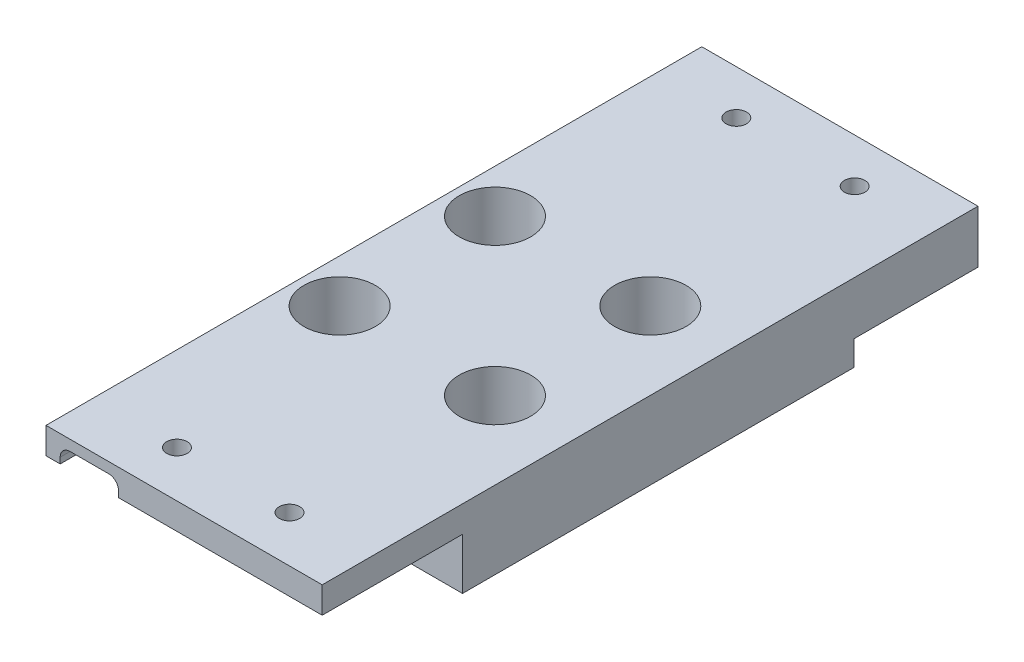
ISO-10303-21;
HEADER;
FILE_DESCRIPTION(('STEP AP214'),'2;1');
FILE_NAME('part.step','',(''),(''),'','','');
FILE_SCHEMA(('AUTOMOTIVE_DESIGN { 1 0 10303 214 1 1 1 1 }'));
ENDSEC;
DATA;
#1=APPLICATION_CONTEXT('core data for automotive mechanical design processes');
#2=APPLICATION_PROTOCOL_DEFINITION('international standard','automotive_design',2000,#1);
#3=PRODUCT_CONTEXT('',#1,'mechanical');
#4=PRODUCT('Part','Part','',(#3));
#5=PRODUCT_RELATED_PRODUCT_CATEGORY('part','',(#4));
#6=PRODUCT_DEFINITION_FORMATION('','',#4);
#7=PRODUCT_DEFINITION_CONTEXT('part definition',#1,'design');
#8=PRODUCT_DEFINITION('design','',#6,#7);
#9=PRODUCT_DEFINITION_SHAPE('','',#8);
#10=(LENGTH_UNIT() NAMED_UNIT(*) SI_UNIT(.MILLI.,.METRE.));
#11=(NAMED_UNIT(*) PLANE_ANGLE_UNIT() SI_UNIT($,.RADIAN.));
#12=(NAMED_UNIT(*) SI_UNIT($,.STERADIAN.) SOLID_ANGLE_UNIT());
#13=UNCERTAINTY_MEASURE_WITH_UNIT(LENGTH_MEASURE(1.E-05),#10,'distance_accuracy_value','');
#14=(GEOMETRIC_REPRESENTATION_CONTEXT(3) GLOBAL_UNCERTAINTY_ASSIGNED_CONTEXT((#13)) GLOBAL_UNIT_ASSIGNED_CONTEXT((#10,
#11,#12)) REPRESENTATION_CONTEXT('',''));
#15=CARTESIAN_POINT('',(0.,0.,0.));
#16=DIRECTION('',(0.,0.,1.));
#17=DIRECTION('',(1.,0.,0.));
#18=AXIS2_PLACEMENT_3D('',#15,#16,#17);
#19=CARTESIAN_POINT('',(22.225,8.255,56.5724449356271));
#20=DIRECTION('',(0.,1.,0.));
#21=DIRECTION('',(0.,0.,1.));
#22=AXIS2_PLACEMENT_3D('',#19,#20,#21);
#23=PLANE('',#22);
#24=CARTESIAN_POINT('',(9.52499998215118,8.255,71.7115405999993));
#25=DIRECTION('',(0.,1.,0.));
#26=DIRECTION('',(0.,0.,1.));
#27=AXIS2_PLACEMENT_3D('',#24,#25,#26);
#28=CIRCLE('',#27,1.64999999999999);
#29=CARTESIAN_POINT('',(9.52499998215118,8.255,73.3615405999993));
#30=VERTEX_POINT('',#29);
#31=EDGE_CURVE('E49',#30,#30,#28,.T.);
#32=ORIENTED_EDGE('',*,*,#31,.T.);
#33=EDGE_LOOP('',(#32));
#34=FACE_BOUND('',#33,.T.);
#35=CARTESIAN_POINT('',(-8.59689660784882,8.255,71.7115405999993));
#36=DIRECTION('',(0.,1.,0.));
#37=DIRECTION('',(0.,0.,1.));
#38=AXIS2_PLACEMENT_3D('',#35,#36,#37);
#39=CIRCLE('',#38,1.64999999999999);
#40=CARTESIAN_POINT('',(-8.59689660784882,8.255,73.3615405999993));
#41=VERTEX_POINT('',#40);
#42=EDGE_CURVE('E314',#41,#41,#39,.T.);
#43=ORIENTED_EDGE('',*,*,#42,.T.);
#44=EDGE_LOOP('',(#43));
#45=FACE_BOUND('',#44,.T.);
#46=DIRECTION('',(-1.,0.,0.));
#47=VECTOR('',#46,1.);
#48=CARTESIAN_POINT('',(22.225,8.255,79.1557218));
#49=LINE('',#48,#47);
#50=CARTESIAN_POINT('',(22.225,8.255,79.1557218));
#51=VERTEX_POINT('',#50);
#52=CARTESIAN_POINT('',(-10.5442004,8.255,79.1557218));
#53=VERTEX_POINT('',#52);
#54=EDGE_CURVE('E165',#51,#53,#49,.T.);
#55=ORIENTED_EDGE('',*,*,#54,.T.);
#56=DIRECTION('',(0.,0.,1.));
#57=VECTOR('',#56,1.);
#58=CARTESIAN_POINT('',(-10.5442004,8.255,79.1557218));
#59=LINE('',#58,#57);
#60=CARTESIAN_POINT('',(-10.5442004,8.255,58.1599449356271));
#61=VERTEX_POINT('',#60);
#62=EDGE_CURVE('E174',#61,#53,#59,.T.);
#63=ORIENTED_EDGE('',*,*,#62,.F.);
#64=CARTESIAN_POINT('',(-12.1317004,8.255,58.1599449356271));
#65=DIRECTION('',(0.,1.,0.));
#66=DIRECTION('',(0.,0.,1.));
#67=AXIS2_PLACEMENT_3D('',#64,#65,#66);
#68=CIRCLE('',#67,1.5875);
#69=CARTESIAN_POINT('',(-12.1317004,8.255,56.5724449356271));
#70=VERTEX_POINT('',#69);
#71=EDGE_CURVE('E13',#61,#70,#68,.T.);
#72=ORIENTED_EDGE('',*,*,#71,.T.);
#73=DIRECTION('',(1.,0.,0.));
#74=VECTOR('',#73,1.);
#75=CARTESIAN_POINT('',(22.225,8.255,56.5724449356271));
#76=LINE('',#75,#74);
#77=CARTESIAN_POINT('',(22.225,8.255,56.5724449356271));
#78=VERTEX_POINT('',#77);
#79=EDGE_CURVE('E188',#70,#78,#76,.T.);
#80=ORIENTED_EDGE('',*,*,#79,.T.);
#81=DIRECTION('',(0.,0.,1.));
#82=VECTOR('',#81,1.);
#83=CARTESIAN_POINT('',(22.225,8.255,79.1557218));
#84=LINE('',#83,#82);
#85=EDGE_CURVE('E184',#78,#51,#84,.T.);
#86=ORIENTED_EDGE('',*,*,#85,.T.);
#87=EDGE_LOOP('',(#55,#63,#72,#80,#86));
#88=FACE_BOUND('',#87,.T.);
#89=ADVANCED_FACE('F45',(#34,#45,#88),#23,.F.);
#90=CARTESIAN_POINT('',(-22.225,12.5,-26.3852406));
#91=DIRECTION('',(0.,0.,1.));
#92=DIRECTION('',(1.,0.,0.));
#93=AXIS2_PLACEMENT_3D('',#90,#91,#92);
#94=PLANE('',#93);
#95=DIRECTION('',(1.,0.,0.));
#96=VECTOR('',#95,1.);
#97=CARTESIAN_POINT('',(22.225,4.,-26.3852406));
#98=LINE('',#97,#96);
#99=CARTESIAN_POINT('',(-22.225,4.,-26.3852406));
#100=VERTEX_POINT('',#99);
#101=CARTESIAN_POINT('',(22.225,4.,-26.3852406));
#102=VERTEX_POINT('',#101);
#103=EDGE_CURVE('E363',#100,#102,#98,.T.);
#104=ORIENTED_EDGE('',*,*,#103,.F.);
#105=DIRECTION('',(0.,-1.,0.));
#106=VECTOR('',#105,1.);
#107=CARTESIAN_POINT('',(-22.225,12.5,-26.3852406));
#108=LINE('',#107,#106);
#109=CARTESIAN_POINT('',(-22.225,12.5,-26.3852406));
#110=VERTEX_POINT('',#109);
#111=EDGE_CURVE('E274',#110,#100,#108,.T.);
#112=ORIENTED_EDGE('',*,*,#111,.F.);
#113=DIRECTION('',(-1.,0.,0.));
#114=VECTOR('',#113,1.);
#115=CARTESIAN_POINT('',(-22.225,12.5,-26.3852406));
#116=LINE('',#115,#114);
#117=CARTESIAN_POINT('',(22.225,12.5,-26.3852406));
#118=VERTEX_POINT('',#117);
#119=EDGE_CURVE('E272',#118,#110,#116,.T.);
#120=ORIENTED_EDGE('',*,*,#119,.F.);
#121=DIRECTION('',(0.,-1.,0.));
#122=VECTOR('',#121,1.);
#123=CARTESIAN_POINT('',(22.225,12.5,-26.3852406));
#124=LINE('',#123,#122);
#125=EDGE_CURVE('E280',#118,#102,#124,.T.);
#126=ORIENTED_EDGE('',*,*,#125,.T.);
#127=EDGE_LOOP('',(#104,#112,#120,#126));
#128=FACE_BOUND('',#127,.T.);
#129=ADVANCED_FACE('F376',(#128),#94,.F.);
#130=CARTESIAN_POINT('',(9.52500001784898,12.5,-19.2362653246633));
#131=DIRECTION('',(0.,1.,0.));
#132=DIRECTION('',(0.,0.,1.));
#133=AXIS2_PLACEMENT_3D('',#130,#131,#132);
#134=CYLINDRICAL_SURFACE('',#133,1.64999999999999);
#135=CARTESIAN_POINT('',(9.52500001784898,12.5,-19.2362653246633));
#136=DIRECTION('',(0.,1.,0.));
#137=DIRECTION('',(0.,0.,1.));
#138=AXIS2_PLACEMENT_3D('',#135,#136,#137);
#139=CIRCLE('',#138,1.64999999999999);
#140=CARTESIAN_POINT('',(9.52500001784898,12.5,-17.5862653246634));
#141=VERTEX_POINT('',#140);
#142=EDGE_CURVE('E263',#141,#141,#139,.T.);
#143=ORIENTED_EDGE('',*,*,#142,.T.);
#144=EDGE_LOOP('',(#143));
#145=FACE_BOUND('',#144,.T.);
#146=CARTESIAN_POINT('',(9.52500001784898,4.,-19.2362653246633));
#147=DIRECTION('',(0.,-1.,0.));
#148=DIRECTION('',(0.,0.,-1.));
#149=AXIS2_PLACEMENT_3D('',#146,#147,#148);
#150=CIRCLE('',#149,1.64999999999999);
#151=CARTESIAN_POINT('',(9.52500001784898,4.,-20.8862653246633));
#152=VERTEX_POINT('',#151);
#153=EDGE_CURVE('E198',#152,#152,#150,.F.);
#154=ORIENTED_EDGE('',*,*,#153,.F.);
#155=EDGE_LOOP('',(#154));
#156=FACE_BOUND('',#155,.T.);
#157=ADVANCED_FACE('F373',(#145,#156),#134,.F.);
#158=CARTESIAN_POINT('',(-9.52500001784898,12.5,-19.2362653246633));
#159=DIRECTION('',(0.,1.,0.));
#160=DIRECTION('',(0.,0.,1.));
#161=AXIS2_PLACEMENT_3D('',#158,#159,#160);
#162=CYLINDRICAL_SURFACE('',#161,1.64999999999999);
#163=CARTESIAN_POINT('',(-9.52500001784898,12.5,-19.2362653246633));
#164=DIRECTION('',(0.,1.,0.));
#165=DIRECTION('',(0.,0.,1.));
#166=AXIS2_PLACEMENT_3D('',#163,#164,#165);
#167=CIRCLE('',#166,1.64999999999999);
#168=CARTESIAN_POINT('',(-9.52500001784898,12.5,-17.5862653246634));
#169=VERTEX_POINT('',#168);
#170=EDGE_CURVE('E260',#169,#169,#167,.T.);
#171=ORIENTED_EDGE('',*,*,#170,.T.);
#172=EDGE_LOOP('',(#171));
#173=FACE_BOUND('',#172,.T.);
#174=CARTESIAN_POINT('',(-9.52500001784898,4.,-19.2362653246633));
#175=DIRECTION('',(0.,-1.,0.));
#176=DIRECTION('',(0.,0.,-1.));
#177=AXIS2_PLACEMENT_3D('',#174,#175,#176);
#178=CIRCLE('',#177,1.64999999999999);
#179=CARTESIAN_POINT('',(-9.52500001784898,4.,-20.8862653246633));
#180=VERTEX_POINT('',#179);
#181=EDGE_CURVE('E284',#180,#180,#178,.F.);
#182=ORIENTED_EDGE('',*,*,#181,.F.);
#183=EDGE_LOOP('',(#182));
#184=FACE_BOUND('',#183,.T.);
#185=ADVANCED_FACE('F375',(#173,#184),#162,.F.);
#186=CARTESIAN_POINT('',(-22.225,12.5,-26.3852406));
#187=DIRECTION('',(1.,0.,0.));
#188=DIRECTION('',(0.,0.,-1.));
#189=AXIS2_PLACEMENT_3D('',#186,#187,#188);
#190=PLANE('',#189);
#191=DIRECTION('',(0.,0.,-1.));
#192=VECTOR('',#191,1.);
#193=CARTESIAN_POINT('',(-22.225,4.,-26.3852406));
#194=LINE('',#193,#192);
#195=CARTESIAN_POINT('',(-22.225,4.,-6.4099656));
#196=VERTEX_POINT('',#195);
#197=EDGE_CURVE('E361',#196,#100,#194,.T.);
#198=ORIENTED_EDGE('',*,*,#197,.F.);
#199=DIRECTION('',(0.,-1.,0.));
#200=VECTOR('',#199,1.);
#201=CARTESIAN_POINT('',(-22.225,4.,-6.4099656));
#202=LINE('',#201,#200);
#203=CARTESIAN_POINT('',(-22.225,0.,-6.4099656));
#204=VERTEX_POINT('',#203);
#205=EDGE_CURVE('E287',#196,#204,#202,.T.);
#206=ORIENTED_EDGE('',*,*,#205,.T.);
#207=DIRECTION('',(0.,0.,1.));
#208=VECTOR('',#207,1.);
#209=CARTESIAN_POINT('',(-22.225,0.,-26.3852406));
#210=LINE('',#209,#208);
#211=CARTESIAN_POINT('',(-22.225,0.,56.5724449356271));
#212=VERTEX_POINT('',#211);
#213=EDGE_CURVE('E266',#204,#212,#210,.T.);
#214=ORIENTED_EDGE('',*,*,#213,.T.);
#215=DIRECTION('',(0.,-1.,0.));
#216=VECTOR('',#215,1.);
#217=CARTESIAN_POINT('',(-22.225,8.255,56.5724449356271));
#218=LINE('',#217,#216);
#219=CARTESIAN_POINT('',(-22.225,8.255,56.5724449356271));
#220=VERTEX_POINT('',#219);
#221=EDGE_CURVE('E195',#220,#212,#218,.T.);
#222=ORIENTED_EDGE('',*,*,#221,.F.);
#223=DIRECTION('',(0.,0.,-1.));
#224=VECTOR('',#223,1.);
#225=CARTESIAN_POINT('',(-22.225,8.255,79.1557218));
#226=LINE('',#225,#224);
#227=CARTESIAN_POINT('',(-22.225,8.255,79.1557218));
#228=VERTEX_POINT('',#227);
#229=EDGE_CURVE('E185',#228,#220,#226,.T.);
#230=ORIENTED_EDGE('',*,*,#229,.F.);
#231=DIRECTION('',(0.,-1.,0.));
#232=VECTOR('',#231,1.);
#233=CARTESIAN_POINT('',(-22.225,12.5,79.1557218));
#234=LINE('',#233,#232);
#235=CARTESIAN_POINT('',(-22.225,12.5,79.1557218));
#236=VERTEX_POINT('',#235);
#237=EDGE_CURVE('E233',#236,#228,#234,.T.);
#238=ORIENTED_EDGE('',*,*,#237,.F.);
#239=DIRECTION('',(0.,0.,1.));
#240=VECTOR('',#239,1.);
#241=CARTESIAN_POINT('',(-22.225,12.5,-26.3852406));
#242=LINE('',#241,#240);
#243=EDGE_CURVE('E267',#110,#236,#242,.T.);
#244=ORIENTED_EDGE('',*,*,#243,.F.);
#245=ORIENTED_EDGE('',*,*,#111,.T.);
#246=EDGE_LOOP('',(#198,#206,#214,#222,#230,#238,#244,#245));
#247=FACE_BOUND('',#246,.T.);
#248=ADVANCED_FACE('F383',(#247),#190,.F.);
#249=CARTESIAN_POINT('',(22.225,12.5,-26.3852406));
#250=DIRECTION('',(-1.,0.,0.));
#251=DIRECTION('',(0.,0.,1.));
#252=AXIS2_PLACEMENT_3D('',#249,#250,#251);
#253=PLANE('',#252);
#254=DIRECTION('',(0.,0.,-1.));
#255=VECTOR('',#254,1.);
#256=CARTESIAN_POINT('',(22.225,0.,-26.3852406));
#257=LINE('',#256,#255);
#258=CARTESIAN_POINT('',(22.225,0.,56.5724449356271));
#259=VERTEX_POINT('',#258);
#260=CARTESIAN_POINT('',(22.225,0.,-6.4099656));
#261=VERTEX_POINT('',#260);
#262=EDGE_CURVE('E270',#259,#261,#257,.T.);
#263=ORIENTED_EDGE('',*,*,#262,.T.);
#264=DIRECTION('',(0.,-1.,0.));
#265=VECTOR('',#264,1.);
#266=CARTESIAN_POINT('',(22.225,4.,-6.4099656));
#267=LINE('',#266,#265);
#268=CARTESIAN_POINT('',(22.225,4.,-6.4099656));
#269=VERTEX_POINT('',#268);
#270=EDGE_CURVE('E364',#269,#261,#267,.T.);
#271=ORIENTED_EDGE('',*,*,#270,.F.);
#272=DIRECTION('',(0.,0.,1.));
#273=VECTOR('',#272,1.);
#274=CARTESIAN_POINT('',(22.225,4.,-26.3852406));
#275=LINE('',#274,#273);
#276=EDGE_CURVE('E352',#102,#269,#275,.T.);
#277=ORIENTED_EDGE('',*,*,#276,.F.);
#278=ORIENTED_EDGE('',*,*,#125,.F.);
#279=DIRECTION('',(0.,0.,-1.));
#280=VECTOR('',#279,1.);
#281=CARTESIAN_POINT('',(22.225,12.5,-26.3852406));
#282=LINE('',#281,#280);
#283=CARTESIAN_POINT('',(22.225,12.5,79.1557218));
#284=VERTEX_POINT('',#283);
#285=EDGE_CURVE('E269',#284,#118,#282,.T.);
#286=ORIENTED_EDGE('',*,*,#285,.F.);
#287=DIRECTION('',(0.,-1.,0.));
#288=VECTOR('',#287,1.);
#289=CARTESIAN_POINT('',(22.225,12.5,79.1557218));
#290=LINE('',#289,#288);
#291=EDGE_CURVE('E231',#284,#51,#290,.T.);
#292=ORIENTED_EDGE('',*,*,#291,.T.);
#293=ORIENTED_EDGE('',*,*,#85,.F.);
#294=DIRECTION('',(0.,-1.,0.));
#295=VECTOR('',#294,1.);
#296=CARTESIAN_POINT('',(22.225,8.255,56.5724449356271));
#297=LINE('',#296,#295);
#298=EDGE_CURVE('E199',#78,#259,#297,.T.);
#299=ORIENTED_EDGE('',*,*,#298,.T.);
#300=EDGE_LOOP('',(#263,#271,#277,#278,#286,#292,#293,#299));
#301=FACE_BOUND('',#300,.T.);
#302=ADVANCED_FACE('F446',(#301),#253,.F.);
#303=CARTESIAN_POINT('',(-22.225,12.5,26.3852406));
#304=DIRECTION('',(0.,1.,0.));
#305=DIRECTION('',(0.,0.,1.));
#306=AXIS2_PLACEMENT_3D('',#303,#304,#305);
#307=PLANE('',#306);
#308=CARTESIAN_POINT('',(9.52499998215118,12.5,71.7115405999993));
#309=DIRECTION('',(0.,1.,0.));
#310=DIRECTION('',(0.,0.,1.));
#311=AXIS2_PLACEMENT_3D('',#308,#309,#310);
#312=CIRCLE('',#311,1.64999999999999);
#313=CARTESIAN_POINT('',(9.52499998215118,12.5,73.3615405999993));
#314=VERTEX_POINT('',#313);
#315=EDGE_CURVE('E807',#314,#314,#312,.T.);
#316=ORIENTED_EDGE('',*,*,#315,.F.);
#317=EDGE_LOOP('',(#316));
#318=FACE_BOUND('',#317,.T.);
#319=CARTESIAN_POINT('',(-8.59689660784882,12.5,71.7115405999993));
#320=DIRECTION('',(0.,1.,0.));
#321=DIRECTION('',(0.,0.,1.));
#322=AXIS2_PLACEMENT_3D('',#319,#320,#321);
#323=CIRCLE('',#322,1.64999999999999);
#324=CARTESIAN_POINT('',(-8.59689660784882,12.5,73.3615405999993));
#325=VERTEX_POINT('',#324);
#326=EDGE_CURVE('E809',#325,#325,#323,.T.);
#327=ORIENTED_EDGE('',*,*,#326,.F.);
#328=EDGE_LOOP('',(#327));
#329=FACE_BOUND('',#328,.T.);
#330=CARTESIAN_POINT('',(-15.24,12.5,38.8852406));
#331=DIRECTION('',(0.,1.,0.));
#332=DIRECTION('',(0.,0.,1.));
#333=AXIS2_PLACEMENT_3D('',#330,#331,#332);
#334=CIRCLE('',#333,5.75);
#335=CARTESIAN_POINT('',(-15.24,12.5,44.6352406));
#336=VERTEX_POINT('',#335);
#337=EDGE_CURVE('E202',#336,#336,#334,.T.);
#338=ORIENTED_EDGE('',*,*,#337,.F.);
#339=EDGE_LOOP('',(#338));
#340=FACE_BOUND('',#339,.T.);
#341=CARTESIAN_POINT('',(9.76,12.5,38.8852406));
#342=DIRECTION('',(0.,1.,0.));
#343=DIRECTION('',(0.,0.,1.));
#344=AXIS2_PLACEMENT_3D('',#341,#342,#343);
#345=CIRCLE('',#344,5.75);
#346=CARTESIAN_POINT('',(9.76,12.5,44.6352406));
#347=VERTEX_POINT('',#346);
#348=EDGE_CURVE('E216',#347,#347,#345,.T.);
#349=ORIENTED_EDGE('',*,*,#348,.F.);
#350=EDGE_LOOP('',(#349));
#351=FACE_BOUND('',#350,.T.);
#352=CARTESIAN_POINT('',(-15.24,12.5,13.8852406));
#353=DIRECTION('',(0.,1.,0.));
#354=DIRECTION('',(0.,0.,1.));
#355=AXIS2_PLACEMENT_3D('',#352,#353,#354);
#356=CIRCLE('',#355,5.75);
#357=CARTESIAN_POINT('',(-15.24,12.5,19.6352406));
#358=VERTEX_POINT('',#357);
#359=EDGE_CURVE('E236',#358,#358,#356,.T.);
#360=ORIENTED_EDGE('',*,*,#359,.F.);
#361=EDGE_LOOP('',(#360));
#362=FACE_BOUND('',#361,.T.);
#363=CARTESIAN_POINT('',(9.76,12.5,13.8852406));
#364=DIRECTION('',(0.,1.,0.));
#365=DIRECTION('',(0.,0.,1.));
#366=AXIS2_PLACEMENT_3D('',#363,#364,#365);
#367=CIRCLE('',#366,5.75);
#368=CARTESIAN_POINT('',(9.76,12.5,19.6352406));
#369=VERTEX_POINT('',#368);
#370=EDGE_CURVE('E248',#369,#369,#367,.T.);
#371=ORIENTED_EDGE('',*,*,#370,.F.);
#372=EDGE_LOOP('',(#371));
#373=FACE_BOUND('',#372,.T.);
#374=ORIENTED_EDGE('',*,*,#170,.F.);
#375=EDGE_LOOP('',(#374));
#376=FACE_BOUND('',#375,.T.);
#377=ORIENTED_EDGE('',*,*,#142,.F.);
#378=EDGE_LOOP('',(#377));
#379=FACE_BOUND('',#378,.T.);
#380=ORIENTED_EDGE('',*,*,#243,.T.);
#381=DIRECTION('',(-1.,0.,0.));
#382=VECTOR('',#381,1.);
#383=CARTESIAN_POINT('',(-22.225,12.5,79.1557218));
#384=LINE('',#383,#382);
#385=EDGE_CURVE('E228',#284,#236,#384,.T.);
#386=ORIENTED_EDGE('',*,*,#385,.F.);
#387=ORIENTED_EDGE('',*,*,#285,.T.);
#388=ORIENTED_EDGE('',*,*,#119,.T.);
#389=EDGE_LOOP('',(#380,#386,#387,#388));
#390=FACE_BOUND('',#389,.T.);
#391=ADVANCED_FACE('F450',(#318,#329,#340,#351,#362,#373,#376,#379,#390),#307,.T.);
#392=CARTESIAN_POINT('',(-22.225,0.,26.3852406));
#393=DIRECTION('',(0.,1.,0.));
#394=DIRECTION('',(0.,0.,1.));
#395=AXIS2_PLACEMENT_3D('',#392,#393,#394);
#396=PLANE('',#395);
#397=CARTESIAN_POINT('',(-15.24,0.,38.8852406));
#398=DIRECTION('',(0.,1.,0.));
#399=DIRECTION('',(0.,0.,1.));
#400=AXIS2_PLACEMENT_3D('',#397,#398,#399);
#401=CIRCLE('',#400,3.3);
#402=CARTESIAN_POINT('',(-15.24,0.,42.1852406));
#403=VERTEX_POINT('',#402);
#404=EDGE_CURVE('E213',#403,#403,#401,.T.);
#405=ORIENTED_EDGE('',*,*,#404,.T.);
#406=EDGE_LOOP('',(#405));
#407=FACE_BOUND('',#406,.T.);
#408=CARTESIAN_POINT('',(9.76,0.,38.8852406));
#409=DIRECTION('',(0.,1.,0.));
#410=DIRECTION('',(0.,0.,1.));
#411=AXIS2_PLACEMENT_3D('',#408,#409,#410);
#412=CIRCLE('',#411,3.3);
#413=CARTESIAN_POINT('',(9.76,0.,42.1852406));
#414=VERTEX_POINT('',#413);
#415=EDGE_CURVE('E225',#414,#414,#412,.T.);
#416=ORIENTED_EDGE('',*,*,#415,.T.);
#417=EDGE_LOOP('',(#416));
#418=FACE_BOUND('',#417,.T.);
#419=CARTESIAN_POINT('',(-15.24,0.,13.8852406));
#420=DIRECTION('',(0.,1.,0.));
#421=DIRECTION('',(0.,0.,1.));
#422=AXIS2_PLACEMENT_3D('',#419,#420,#421);
#423=CIRCLE('',#422,3.3);
#424=CARTESIAN_POINT('',(-15.24,0.,17.1852406));
#425=VERTEX_POINT('',#424);
#426=EDGE_CURVE('E245',#425,#425,#423,.T.);
#427=ORIENTED_EDGE('',*,*,#426,.T.);
#428=EDGE_LOOP('',(#427));
#429=FACE_BOUND('',#428,.T.);
#430=CARTESIAN_POINT('',(9.76,0.,13.8852406));
#431=DIRECTION('',(0.,1.,0.));
#432=DIRECTION('',(0.,0.,1.));
#433=AXIS2_PLACEMENT_3D('',#430,#431,#432);
#434=CIRCLE('',#433,3.3);
#435=CARTESIAN_POINT('',(9.76,0.,17.1852406));
#436=VERTEX_POINT('',#435);
#437=EDGE_CURVE('E257',#436,#436,#434,.T.);
#438=ORIENTED_EDGE('',*,*,#437,.T.);
#439=EDGE_LOOP('',(#438));
#440=FACE_BOUND('',#439,.T.);
#441=ORIENTED_EDGE('',*,*,#213,.F.);
#442=DIRECTION('',(-1.,0.,0.));
#443=VECTOR('',#442,1.);
#444=CARTESIAN_POINT('',(22.225,0.,-6.4099656));
#445=LINE('',#444,#443);
#446=EDGE_CURVE('E350',#261,#204,#445,.T.);
#447=ORIENTED_EDGE('',*,*,#446,.F.);
#448=ORIENTED_EDGE('',*,*,#262,.F.);
#449=DIRECTION('',(1.,0.,0.));
#450=VECTOR('',#449,1.);
#451=CARTESIAN_POINT('',(22.225,0.,56.5724449356271));
#452=LINE('',#451,#450);
#453=EDGE_CURVE('E196',#212,#259,#452,.T.);
#454=ORIENTED_EDGE('',*,*,#453,.F.);
#455=EDGE_LOOP('',(#441,#447,#448,#454));
#456=FACE_BOUND('',#455,.T.);
#457=ADVANCED_FACE('F443',(#407,#418,#429,#440,#456),#396,.F.);
#458=CARTESIAN_POINT('',(9.76,12.5,13.8852406));
#459=DIRECTION('',(0.,1.,0.));
#460=DIRECTION('',(0.,0.,1.));
#461=AXIS2_PLACEMENT_3D('',#458,#459,#460);
#462=CYLINDRICAL_SURFACE('',#461,3.3);
#463=ORIENTED_EDGE('',*,*,#437,.F.);
#464=EDGE_LOOP('',(#463));
#465=FACE_BOUND('',#464,.T.);
#466=CARTESIAN_POINT('',(9.76,4.2,13.8852406));
#467=DIRECTION('',(0.,1.,0.));
#468=DIRECTION('',(0.,0.,1.));
#469=AXIS2_PLACEMENT_3D('',#466,#467,#468);
#470=CIRCLE('',#469,3.3);
#471=CARTESIAN_POINT('',(9.76,4.2,17.1852406));
#472=VERTEX_POINT('',#471);
#473=EDGE_CURVE('E254',#472,#472,#470,.T.);
#474=ORIENTED_EDGE('',*,*,#473,.T.);
#475=EDGE_LOOP('',(#474));
#476=FACE_BOUND('',#475,.T.);
#477=ADVANCED_FACE('F464',(#465,#476),#462,.F.);
#478=CARTESIAN_POINT('',(13.06,4.2,13.8852406));
#479=DIRECTION('',(0.,-1.,0.));
#480=DIRECTION('',(0.,0.,-1.));
#481=AXIS2_PLACEMENT_3D('',#478,#479,#480);
#482=PLANE('',#481);
#483=ORIENTED_EDGE('',*,*,#473,.F.);
#484=EDGE_LOOP('',(#483));
#485=FACE_BOUND('',#484,.T.);
#486=CARTESIAN_POINT('',(9.76,4.2,13.8852406));
#487=DIRECTION('',(0.,1.,0.));
#488=DIRECTION('',(0.,0.,1.));
#489=AXIS2_PLACEMENT_3D('',#486,#487,#488);
#490=CIRCLE('',#489,5.75);
#491=CARTESIAN_POINT('',(9.76,4.2,19.6352406));
#492=VERTEX_POINT('',#491);
#493=EDGE_CURVE('E251',#492,#492,#490,.T.);
#494=ORIENTED_EDGE('',*,*,#493,.T.);
#495=EDGE_LOOP('',(#494));
#496=FACE_BOUND('',#495,.T.);
#497=ADVANCED_FACE('F630',(#485,#496),#482,.F.);
#498=CARTESIAN_POINT('',(9.76,12.5,13.8852406));
#499=DIRECTION('',(0.,1.,0.));
#500=DIRECTION('',(0.,0.,1.));
#501=AXIS2_PLACEMENT_3D('',#498,#499,#500);
#502=CYLINDRICAL_SURFACE('',#501,5.75);
#503=ORIENTED_EDGE('',*,*,#493,.F.);
#504=EDGE_LOOP('',(#503));
#505=FACE_BOUND('',#504,.T.);
#506=ORIENTED_EDGE('',*,*,#370,.T.);
#507=EDGE_LOOP('',(#506));
#508=FACE_BOUND('',#507,.T.);
#509=ADVANCED_FACE('F638',(#505,#508),#502,.F.);
#510=CARTESIAN_POINT('',(-15.24,12.5,13.8852406));
#511=DIRECTION('',(0.,1.,0.));
#512=DIRECTION('',(0.,0.,1.));
#513=AXIS2_PLACEMENT_3D('',#510,#511,#512);
#514=CYLINDRICAL_SURFACE('',#513,3.3);
#515=ORIENTED_EDGE('',*,*,#426,.F.);
#516=EDGE_LOOP('',(#515));
#517=FACE_BOUND('',#516,.T.);
#518=CARTESIAN_POINT('',(-15.24,4.2,13.8852406));
#519=DIRECTION('',(0.,1.,0.));
#520=DIRECTION('',(0.,0.,1.));
#521=AXIS2_PLACEMENT_3D('',#518,#519,#520);
#522=CIRCLE('',#521,3.3);
#523=CARTESIAN_POINT('',(-15.24,4.2,17.1852406));
#524=VERTEX_POINT('',#523);
#525=EDGE_CURVE('E242',#524,#524,#522,.T.);
#526=ORIENTED_EDGE('',*,*,#525,.T.);
#527=EDGE_LOOP('',(#526));
#528=FACE_BOUND('',#527,.T.);
#529=ADVANCED_FACE('F646',(#517,#528),#514,.F.);
#530=CARTESIAN_POINT('',(-11.94,4.2,13.8852406));
#531=DIRECTION('',(0.,-1.,0.));
#532=DIRECTION('',(0.,0.,-1.));
#533=AXIS2_PLACEMENT_3D('',#530,#531,#532);
#534=PLANE('',#533);
#535=ORIENTED_EDGE('',*,*,#525,.F.);
#536=EDGE_LOOP('',(#535));
#537=FACE_BOUND('',#536,.T.);
#538=CARTESIAN_POINT('',(-15.24,4.2,13.8852406));
#539=DIRECTION('',(0.,1.,0.));
#540=DIRECTION('',(0.,0.,1.));
#541=AXIS2_PLACEMENT_3D('',#538,#539,#540);
#542=CIRCLE('',#541,5.75);
#543=CARTESIAN_POINT('',(-15.24,4.2,19.6352406));
#544=VERTEX_POINT('',#543);
#545=EDGE_CURVE('E239',#544,#544,#542,.T.);
#546=ORIENTED_EDGE('',*,*,#545,.T.);
#547=EDGE_LOOP('',(#546));
#548=FACE_BOUND('',#547,.T.);
#549=ADVANCED_FACE('F654',(#537,#548),#534,.F.);
#550=CARTESIAN_POINT('',(-15.24,12.5,13.8852406));
#551=DIRECTION('',(0.,1.,0.));
#552=DIRECTION('',(0.,0.,1.));
#553=AXIS2_PLACEMENT_3D('',#550,#551,#552);
#554=CYLINDRICAL_SURFACE('',#553,5.75);
#555=ORIENTED_EDGE('',*,*,#545,.F.);
#556=EDGE_LOOP('',(#555));
#557=FACE_BOUND('',#556,.T.);
#558=ORIENTED_EDGE('',*,*,#359,.T.);
#559=EDGE_LOOP('',(#558));
#560=FACE_BOUND('',#559,.T.);
#561=ADVANCED_FACE('F662',(#557,#560),#554,.F.);
#562=CARTESIAN_POINT('',(-22.225,12.5,79.1557218));
#563=DIRECTION('',(0.,0.,1.));
#564=DIRECTION('',(1.,0.,0.));
#565=AXIS2_PLACEMENT_3D('',#562,#563,#564);
#566=PLANE('',#565);
#567=DIRECTION('',(-1.,0.,0.));
#568=VECTOR('',#567,1.);
#569=CARTESIAN_POINT('',(-10.5442004,10.795,79.1557218));
#570=LINE('',#569,#568);
#571=CARTESIAN_POINT('',(-12.1317004,10.795,79.1557218));
#572=VERTEX_POINT('',#571);
#573=CARTESIAN_POINT('',(-18.3547004,10.795,79.1557218));
#574=VERTEX_POINT('',#573);
#575=EDGE_CURVE('E171',#572,#574,#570,.T.);
#576=ORIENTED_EDGE('',*,*,#575,.F.);
#577=CARTESIAN_POINT('',(-12.1317004,9.2075,79.1557218));
#578=DIRECTION('',(0.,0.,1.));
#579=DIRECTION('',(1.,0.,0.));
#580=AXIS2_PLACEMENT_3D('',#577,#578,#579);
#581=CIRCLE('',#580,1.5875);
#582=CARTESIAN_POINT('',(-10.5442004,9.2075,79.1557218));
#583=VERTEX_POINT('',#582);
#584=EDGE_CURVE('E167',#572,#583,#581,.F.);
#585=ORIENTED_EDGE('',*,*,#584,.T.);
#586=DIRECTION('',(0.,-1.,0.));
#587=VECTOR('',#586,1.);
#588=CARTESIAN_POINT('',(-10.5442004,10.795,79.1557218));
#589=LINE('',#588,#587);
#590=EDGE_CURVE('E159',#583,#53,#589,.T.);
#591=ORIENTED_EDGE('',*,*,#590,.T.);
#592=ORIENTED_EDGE('',*,*,#54,.F.);
#593=ORIENTED_EDGE('',*,*,#291,.F.);
#594=ORIENTED_EDGE('',*,*,#385,.T.);
#595=ORIENTED_EDGE('',*,*,#237,.T.);
#596=CARTESIAN_POINT('',(-19.9422004,8.255,79.1557218));
#597=VERTEX_POINT('',#596);
#598=EDGE_CURVE('E186',#597,#228,#49,.T.);
#599=ORIENTED_EDGE('',*,*,#598,.F.);
#600=DIRECTION('',(0.,-1.,0.));
#601=VECTOR('',#600,1.);
#602=CARTESIAN_POINT('',(-19.9422004,10.795,79.1557218));
#603=LINE('',#602,#601);
#604=CARTESIAN_POINT('',(-19.9422004,9.2075,79.1557218));
#605=VERTEX_POINT('',#604);
#606=EDGE_CURVE('E170',#605,#597,#603,.T.);
#607=ORIENTED_EDGE('',*,*,#606,.F.);
#608=CARTESIAN_POINT('',(-18.3547004,9.2075,79.1557218));
#609=DIRECTION('',(0.,0.,1.));
#610=DIRECTION('',(1.,0.,0.));
#611=AXIS2_PLACEMENT_3D('',#608,#609,#610);
#612=CIRCLE('',#611,1.5875);
#613=EDGE_CURVE('E307',#605,#574,#612,.F.);
#614=ORIENTED_EDGE('',*,*,#613,.T.);
#615=EDGE_LOOP('',(#576,#585,#591,#592,#593,#594,#595,#599,#607,#614));
#616=FACE_BOUND('',#615,.T.);
#617=ADVANCED_FACE('F162',(#616),#566,.T.);
#618=CARTESIAN_POINT('',(9.76,12.5,38.8852406));
#619=DIRECTION('',(0.,1.,0.));
#620=DIRECTION('',(0.,0.,1.));
#621=AXIS2_PLACEMENT_3D('',#618,#619,#620);
#622=CYLINDRICAL_SURFACE('',#621,3.3);
#623=ORIENTED_EDGE('',*,*,#415,.F.);
#624=EDGE_LOOP('',(#623));
#625=FACE_BOUND('',#624,.T.);
#626=CARTESIAN_POINT('',(9.76,4.2,38.8852406));
#627=DIRECTION('',(0.,1.,0.));
#628=DIRECTION('',(0.,0.,1.));
#629=AXIS2_PLACEMENT_3D('',#626,#627,#628);
#630=CIRCLE('',#629,3.3);
#631=CARTESIAN_POINT('',(9.76,4.2,42.1852406));
#632=VERTEX_POINT('',#631);
#633=EDGE_CURVE('E222',#632,#632,#630,.T.);
#634=ORIENTED_EDGE('',*,*,#633,.T.);
#635=EDGE_LOOP('',(#634));
#636=FACE_BOUND('',#635,.T.);
#637=ADVANCED_FACE('F676',(#625,#636),#622,.F.);
#638=CARTESIAN_POINT('',(13.06,4.2,38.8852406));
#639=DIRECTION('',(0.,-1.,0.));
#640=DIRECTION('',(0.,0.,-1.));
#641=AXIS2_PLACEMENT_3D('',#638,#639,#640);
#642=PLANE('',#641);
#643=ORIENTED_EDGE('',*,*,#633,.F.);
#644=EDGE_LOOP('',(#643));
#645=FACE_BOUND('',#644,.T.);
#646=CARTESIAN_POINT('',(9.76,4.2,38.8852406));
#647=DIRECTION('',(0.,1.,0.));
#648=DIRECTION('',(0.,0.,1.));
#649=AXIS2_PLACEMENT_3D('',#646,#647,#648);
#650=CIRCLE('',#649,5.75);
#651=CARTESIAN_POINT('',(9.76,4.2,44.6352406));
#652=VERTEX_POINT('',#651);
#653=EDGE_CURVE('E219',#652,#652,#650,.T.);
#654=ORIENTED_EDGE('',*,*,#653,.T.);
#655=EDGE_LOOP('',(#654));
#656=FACE_BOUND('',#655,.T.);
#657=ADVANCED_FACE('F681',(#645,#656),#642,.F.);
#658=CARTESIAN_POINT('',(9.76,12.5,38.8852406));
#659=DIRECTION('',(0.,1.,0.));
#660=DIRECTION('',(0.,0.,1.));
#661=AXIS2_PLACEMENT_3D('',#658,#659,#660);
#662=CYLINDRICAL_SURFACE('',#661,5.75);
#663=ORIENTED_EDGE('',*,*,#653,.F.);
#664=EDGE_LOOP('',(#663));
#665=FACE_BOUND('',#664,.T.);
#666=ORIENTED_EDGE('',*,*,#348,.T.);
#667=EDGE_LOOP('',(#666));
#668=FACE_BOUND('',#667,.T.);
#669=ADVANCED_FACE('F689',(#665,#668),#662,.F.);
#670=CARTESIAN_POINT('',(-15.24,12.5,38.8852406));
#671=DIRECTION('',(0.,1.,0.));
#672=DIRECTION('',(0.,0.,1.));
#673=AXIS2_PLACEMENT_3D('',#670,#671,#672);
#674=CYLINDRICAL_SURFACE('',#673,3.3);
#675=ORIENTED_EDGE('',*,*,#404,.F.);
#676=EDGE_LOOP('',(#675));
#677=FACE_BOUND('',#676,.T.);
#678=CARTESIAN_POINT('',(-15.24,4.2,38.8852406));
#679=DIRECTION('',(0.,1.,0.));
#680=DIRECTION('',(0.,0.,1.));
#681=AXIS2_PLACEMENT_3D('',#678,#679,#680);
#682=CIRCLE('',#681,3.3);
#683=CARTESIAN_POINT('',(-15.24,4.2,42.1852406));
#684=VERTEX_POINT('',#683);
#685=EDGE_CURVE('E210',#684,#684,#682,.T.);
#686=ORIENTED_EDGE('',*,*,#685,.T.);
#687=EDGE_LOOP('',(#686));
#688=FACE_BOUND('',#687,.T.);
#689=ADVANCED_FACE('F697',(#677,#688),#674,.F.);
#690=CARTESIAN_POINT('',(-11.94,4.2,38.8852406));
#691=DIRECTION('',(0.,-1.,0.));
#692=DIRECTION('',(0.,0.,-1.));
#693=AXIS2_PLACEMENT_3D('',#690,#691,#692);
#694=PLANE('',#693);
#695=ORIENTED_EDGE('',*,*,#685,.F.);
#696=EDGE_LOOP('',(#695));
#697=FACE_BOUND('',#696,.T.);
#698=CARTESIAN_POINT('',(-15.24,4.2,38.8852406));
#699=DIRECTION('',(0.,1.,0.));
#700=DIRECTION('',(0.,0.,1.));
#701=AXIS2_PLACEMENT_3D('',#698,#699,#700);
#702=CIRCLE('',#701,5.75);
#703=CARTESIAN_POINT('',(-15.24,4.2,44.6352406));
#704=VERTEX_POINT('',#703);
#705=EDGE_CURVE('E207',#704,#704,#702,.T.);
#706=ORIENTED_EDGE('',*,*,#705,.T.);
#707=EDGE_LOOP('',(#706));
#708=FACE_BOUND('',#707,.T.);
#709=ADVANCED_FACE('F705',(#697,#708),#694,.F.);
#710=CARTESIAN_POINT('',(-15.24,12.5,38.8852406));
#711=DIRECTION('',(0.,1.,0.));
#712=DIRECTION('',(0.,0.,1.));
#713=AXIS2_PLACEMENT_3D('',#710,#711,#712);
#714=CYLINDRICAL_SURFACE('',#713,5.75);
#715=ORIENTED_EDGE('',*,*,#705,.F.);
#716=EDGE_LOOP('',(#715));
#717=FACE_BOUND('',#716,.T.);
#718=ORIENTED_EDGE('',*,*,#337,.T.);
#719=EDGE_LOOP('',(#718));
#720=FACE_BOUND('',#719,.T.);
#721=ADVANCED_FACE('F409',(#717,#720),#714,.F.);
#722=CARTESIAN_POINT('',(22.225,8.255,56.5724449356271));
#723=DIRECTION('',(0.,0.,-1.));
#724=DIRECTION('',(-1.,0.,0.));
#725=AXIS2_PLACEMENT_3D('',#722,#723,#724);
#726=PLANE('',#725);
#727=DIRECTION('',(0.,-1.,0.));
#728=VECTOR('',#727,1.);
#729=CARTESIAN_POINT('',(-18.3547004,8.255,56.5724449356271));
#730=LINE('',#729,#728);
#731=CARTESIAN_POINT('',(-18.3547004,9.2075,56.5724449356271));
#732=VERTEX_POINT('',#731);
#733=CARTESIAN_POINT('',(-18.3547004,8.255,56.5724449356271));
#734=VERTEX_POINT('',#733);
#735=EDGE_CURVE('E301',#732,#734,#730,.T.);
#736=ORIENTED_EDGE('',*,*,#735,.T.);
#737=EDGE_CURVE('E193',#220,#734,#76,.T.);
#738=ORIENTED_EDGE('',*,*,#737,.F.);
#739=ORIENTED_EDGE('',*,*,#221,.T.);
#740=ORIENTED_EDGE('',*,*,#453,.T.);
#741=ORIENTED_EDGE('',*,*,#298,.F.);
#742=ORIENTED_EDGE('',*,*,#79,.F.);
#743=DIRECTION('',(0.,-1.,0.));
#744=VECTOR('',#743,1.);
#745=CARTESIAN_POINT('',(-12.1317004,10.795,56.5724449356271));
#746=LINE('',#745,#744);
#747=CARTESIAN_POINT('',(-12.1317004,9.2075,56.5724449356271));
#748=VERTEX_POINT('',#747);
#749=EDGE_CURVE('E297',#70,#748,#746,.F.);
#750=ORIENTED_EDGE('',*,*,#749,.T.);
#751=DIRECTION('',(1.,0.,0.));
#752=VECTOR('',#751,1.);
#753=CARTESIAN_POINT('',(-19.9422004,9.2075,56.5724449356271));
#754=LINE('',#753,#752);
#755=EDGE_CURVE('E299',#748,#732,#754,.F.);
#756=ORIENTED_EDGE('',*,*,#755,.T.);
#757=EDGE_LOOP('',(#736,#738,#739,#740,#741,#742,#750,#756));
#758=FACE_BOUND('',#757,.T.);
#759=ADVANCED_FACE('F400',(#758),#726,.F.);
#760=ORIENTED_EDGE('',*,*,#737,.T.);
#761=CARTESIAN_POINT('',(-18.3547004,8.255,58.1599449356271));
#762=DIRECTION('',(0.,1.,0.));
#763=DIRECTION('',(0.,0.,1.));
#764=AXIS2_PLACEMENT_3D('',#761,#762,#763);
#765=CIRCLE('',#764,1.5875);
#766=CARTESIAN_POINT('',(-19.9422004,8.255,58.1599449356271));
#767=VERTEX_POINT('',#766);
#768=EDGE_CURVE('E54',#734,#767,#765,.T.);
#769=ORIENTED_EDGE('',*,*,#768,.T.);
#770=DIRECTION('',(0.,0.,-1.));
#771=VECTOR('',#770,1.);
#772=CARTESIAN_POINT('',(-19.9422004,8.255,79.1557218));
#773=LINE('',#772,#771);
#774=EDGE_CURVE('E180',#597,#767,#773,.T.);
#775=ORIENTED_EDGE('',*,*,#774,.F.);
#776=ORIENTED_EDGE('',*,*,#598,.T.);
#777=ORIENTED_EDGE('',*,*,#229,.T.);
#778=EDGE_LOOP('',(#760,#769,#775,#776,#777));
#779=FACE_BOUND('',#778,.T.);
#780=ADVANCED_FACE('F392',(#779),#23,.F.);
#781=CARTESIAN_POINT('',(22.225,4.,-6.4099656));
#782=DIRECTION('',(0.,-1.,0.));
#783=DIRECTION('',(0.,0.,-1.));
#784=AXIS2_PLACEMENT_3D('',#781,#782,#783);
#785=PLANE('',#784);
#786=ORIENTED_EDGE('',*,*,#181,.T.);
#787=EDGE_LOOP('',(#786));
#788=FACE_BOUND('',#787,.T.);
#789=ORIENTED_EDGE('',*,*,#276,.T.);
#790=DIRECTION('',(-1.,0.,0.));
#791=VECTOR('',#790,1.);
#792=CARTESIAN_POINT('',(22.225,4.,-6.4099656));
#793=LINE('',#792,#791);
#794=EDGE_CURVE('E358',#269,#196,#793,.T.);
#795=ORIENTED_EDGE('',*,*,#794,.T.);
#796=ORIENTED_EDGE('',*,*,#197,.T.);
#797=ORIENTED_EDGE('',*,*,#103,.T.);
#798=EDGE_LOOP('',(#789,#795,#796,#797));
#799=FACE_BOUND('',#798,.T.);
#800=ORIENTED_EDGE('',*,*,#153,.T.);
#801=EDGE_LOOP('',(#800));
#802=FACE_BOUND('',#801,.T.);
#803=ADVANCED_FACE('F371',(#788,#799,#802),#785,.T.);
#804=CARTESIAN_POINT('',(22.225,4.,-6.4099656));
#805=DIRECTION('',(0.,0.,1.));
#806=DIRECTION('',(1.,0.,0.));
#807=AXIS2_PLACEMENT_3D('',#804,#805,#806);
#808=PLANE('',#807);
#809=ORIENTED_EDGE('',*,*,#446,.T.);
#810=ORIENTED_EDGE('',*,*,#205,.F.);
#811=ORIENTED_EDGE('',*,*,#794,.F.);
#812=ORIENTED_EDGE('',*,*,#270,.T.);
#813=EDGE_LOOP('',(#809,#810,#811,#812));
#814=FACE_BOUND('',#813,.T.);
#815=ADVANCED_FACE('F406',(#814),#808,.F.);
#816=CARTESIAN_POINT('',(-10.5442004,10.795,79.1557218));
#817=DIRECTION('',(1.,0.,0.));
#818=DIRECTION('',(0.,0.,-1.));
#819=AXIS2_PLACEMENT_3D('',#816,#817,#818);
#820=PLANE('',#819);
#821=ORIENTED_EDGE('',*,*,#590,.F.);
#822=DIRECTION('',(0.,0.,1.));
#823=VECTOR('',#822,1.);
#824=CARTESIAN_POINT('',(-10.5442004,9.2075,56.5724449356271));
#825=LINE('',#824,#823);
#826=CARTESIAN_POINT('',(-10.5442004,9.2075,58.1599449356271));
#827=VERTEX_POINT('',#826);
#828=EDGE_CURVE('E295',#583,#827,#825,.F.);
#829=ORIENTED_EDGE('',*,*,#828,.T.);
#830=DIRECTION('',(0.,-1.,0.));
#831=VECTOR('',#830,1.);
#832=CARTESIAN_POINT('',(-10.5442004,8.255,58.1599449356271));
#833=LINE('',#832,#831);
#834=EDGE_CURVE('E177',#827,#61,#833,.T.);
#835=ORIENTED_EDGE('',*,*,#834,.T.);
#836=ORIENTED_EDGE('',*,*,#62,.T.);
#837=EDGE_LOOP('',(#821,#829,#835,#836));
#838=FACE_BOUND('',#837,.T.);
#839=ADVANCED_FACE('F175',(#838),#820,.F.);
#840=CARTESIAN_POINT('',(-19.9422004,10.795,79.1557218));
#841=DIRECTION('',(-1.,0.,0.));
#842=DIRECTION('',(0.,0.,1.));
#843=AXIS2_PLACEMENT_3D('',#840,#841,#842);
#844=PLANE('',#843);
#845=DIRECTION('',(0.,-1.,0.));
#846=VECTOR('',#845,1.);
#847=CARTESIAN_POINT('',(-19.9422004,10.795,58.1599449356271));
#848=LINE('',#847,#846);
#849=CARTESIAN_POINT('',(-19.9422004,9.2075,58.1599449356271));
#850=VERTEX_POINT('',#849);
#851=EDGE_CURVE('E62',#767,#850,#848,.F.);
#852=ORIENTED_EDGE('',*,*,#851,.T.);
#853=DIRECTION('',(0.,0.,-1.));
#854=VECTOR('',#853,1.);
#855=CARTESIAN_POINT('',(-19.9422004,9.2075,79.1557218));
#856=LINE('',#855,#854);
#857=EDGE_CURVE('E66',#850,#605,#856,.F.);
#858=ORIENTED_EDGE('',*,*,#857,.T.);
#859=ORIENTED_EDGE('',*,*,#606,.T.);
#860=ORIENTED_EDGE('',*,*,#774,.T.);
#861=EDGE_LOOP('',(#852,#858,#859,#860));
#862=FACE_BOUND('',#861,.T.);
#863=ADVANCED_FACE('F420',(#862),#844,.F.);
#864=CARTESIAN_POINT('',(-10.5442004,10.795,56.5724449356271));
#865=DIRECTION('',(0.,1.,0.));
#866=DIRECTION('',(0.,0.,1.));
#867=AXIS2_PLACEMENT_3D('',#864,#865,#866);
#868=PLANE('',#867);
#869=DIRECTION('',(1.,0.,0.));
#870=VECTOR('',#869,1.);
#871=CARTESIAN_POINT('',(-10.5442004,10.795,58.1599449356271));
#872=LINE('',#871,#870);
#873=CARTESIAN_POINT('',(-18.3547004,10.795,58.1599449356271));
#874=VERTEX_POINT('',#873);
#875=CARTESIAN_POINT('',(-12.1317004,10.795,58.1599449356271));
#876=VERTEX_POINT('',#875);
#877=EDGE_CURVE('E289',#874,#876,#872,.T.);
#878=ORIENTED_EDGE('',*,*,#877,.T.);
#879=DIRECTION('',(0.,0.,1.));
#880=VECTOR('',#879,1.);
#881=CARTESIAN_POINT('',(-12.1317004,10.795,79.1557218));
#882=LINE('',#881,#880);
#883=EDGE_CURVE('E291',#876,#572,#882,.T.);
#884=ORIENTED_EDGE('',*,*,#883,.T.);
#885=ORIENTED_EDGE('',*,*,#575,.T.);
#886=DIRECTION('',(0.,0.,-1.));
#887=VECTOR('',#886,1.);
#888=CARTESIAN_POINT('',(-18.3547004,10.795,56.5724449356271));
#889=LINE('',#888,#887);
#890=EDGE_CURVE('E283',#574,#874,#889,.T.);
#891=ORIENTED_EDGE('',*,*,#890,.T.);
#892=EDGE_LOOP('',(#878,#884,#885,#891));
#893=FACE_BOUND('',#892,.T.);
#894=ADVANCED_FACE('F341',(#893),#868,.F.);
#895=CARTESIAN_POINT('',(-18.3547004,8.255,58.1599449356271));
#896=DIRECTION('',(0.,1.,0.));
#897=DIRECTION('',(0.,0.,1.));
#898=AXIS2_PLACEMENT_3D('',#895,#896,#897);
#899=CYLINDRICAL_SURFACE('',#898,1.5875);
#900=ORIENTED_EDGE('',*,*,#768,.F.);
#901=ORIENTED_EDGE('',*,*,#735,.F.);
#902=CARTESIAN_POINT('',(-18.3547004,9.2075,58.1599449356271));
#903=DIRECTION('',(0.,-1.,0.));
#904=DIRECTION('',(0.,0.,-1.));
#905=AXIS2_PLACEMENT_3D('',#902,#903,#904);
#906=CIRCLE('',#905,1.5875);
#907=EDGE_CURVE('E181',#850,#732,#906,.T.);
#908=ORIENTED_EDGE('',*,*,#907,.F.);
#909=ORIENTED_EDGE('',*,*,#851,.F.);
#910=EDGE_LOOP('',(#900,#901,#908,#909));
#911=FACE_BOUND('',#910,.T.);
#912=ADVANCED_FACE('F47',(#911),#899,.F.);
#913=CARTESIAN_POINT('',(-18.3547004,9.2075,56.5724449356271));
#914=DIRECTION('',(0.,0.,1.));
#915=DIRECTION('',(1.,0.,0.));
#916=AXIS2_PLACEMENT_3D('',#913,#914,#915);
#917=CYLINDRICAL_SURFACE('',#916,1.5875);
#918=ORIENTED_EDGE('',*,*,#613,.F.);
#919=ORIENTED_EDGE('',*,*,#857,.F.);
#920=CARTESIAN_POINT('',(-18.3547004,9.2075,58.1599449356271));
#921=DIRECTION('',(0.,0.,1.));
#922=DIRECTION('',(1.,0.,0.));
#923=AXIS2_PLACEMENT_3D('',#920,#921,#922);
#924=CIRCLE('',#923,1.5875);
#925=EDGE_CURVE('E323',#874,#850,#924,.T.);
#926=ORIENTED_EDGE('',*,*,#925,.F.);
#927=ORIENTED_EDGE('',*,*,#890,.F.);
#928=EDGE_LOOP('',(#918,#919,#926,#927));
#929=FACE_BOUND('',#928,.T.);
#930=ADVANCED_FACE('F347',(#929),#917,.F.);
#931=CARTESIAN_POINT('',(-18.3547004,9.2075,58.1599449356271));
#932=DIRECTION('',(0.,0.,1.));
#933=DIRECTION('',(1.,0.,0.));
#934=AXIS2_PLACEMENT_3D('',#931,#932,#933);
#935=SPHERICAL_SURFACE('',#934,1.5875);
#936=ORIENTED_EDGE('',*,*,#925,.T.);
#937=ORIENTED_EDGE('',*,*,#907,.T.);
#938=CARTESIAN_POINT('',(-18.3547004,9.2075,58.1599449356271));
#939=DIRECTION('',(1.,0.,0.));
#940=DIRECTION('',(0.,1.,0.));
#941=AXIS2_PLACEMENT_3D('',#938,#939,#940);
#942=CIRCLE('',#941,1.5875);
#943=EDGE_CURVE('E320',#874,#732,#942,.F.);
#944=ORIENTED_EDGE('',*,*,#943,.F.);
#945=EDGE_LOOP('',(#936,#937,#944));
#946=FACE_BOUND('',#945,.T.);
#947=ADVANCED_FACE('F329',(#946),#935,.F.);
#948=CARTESIAN_POINT('',(-12.1317004,10.795,58.1599449356271));
#949=DIRECTION('',(0.,1.,0.));
#950=DIRECTION('',(0.,0.,1.));
#951=AXIS2_PLACEMENT_3D('',#948,#949,#950);
#952=CYLINDRICAL_SURFACE('',#951,1.5875);
#953=ORIENTED_EDGE('',*,*,#71,.F.);
#954=ORIENTED_EDGE('',*,*,#834,.F.);
#955=CARTESIAN_POINT('',(-12.1317004,9.2075,58.1599449356271));
#956=DIRECTION('',(0.,-1.,0.));
#957=DIRECTION('',(0.,0.,-1.));
#958=AXIS2_PLACEMENT_3D('',#955,#956,#957);
#959=CIRCLE('',#958,1.5875);
#960=EDGE_CURVE('E317',#748,#827,#959,.T.);
#961=ORIENTED_EDGE('',*,*,#960,.F.);
#962=ORIENTED_EDGE('',*,*,#749,.F.);
#963=EDGE_LOOP('',(#953,#954,#961,#962));
#964=FACE_BOUND('',#963,.T.);
#965=ADVANCED_FACE('F483',(#964),#952,.F.);
#966=CARTESIAN_POINT('',(-10.5442004,9.2075,58.1599449356271));
#967=DIRECTION('',(-1.,0.,0.));
#968=DIRECTION('',(0.,0.,1.));
#969=AXIS2_PLACEMENT_3D('',#966,#967,#968);
#970=CYLINDRICAL_SURFACE('',#969,1.5875);
#971=ORIENTED_EDGE('',*,*,#943,.T.);
#972=ORIENTED_EDGE('',*,*,#755,.F.);
#973=CARTESIAN_POINT('',(-12.1317004,9.2075,58.1599449356271));
#974=DIRECTION('',(-1.,0.,0.));
#975=DIRECTION('',(0.,0.,1.));
#976=AXIS2_PLACEMENT_3D('',#973,#974,#975);
#977=CIRCLE('',#976,1.5875);
#978=EDGE_CURVE('E313',#876,#748,#977,.T.);
#979=ORIENTED_EDGE('',*,*,#978,.F.);
#980=ORIENTED_EDGE('',*,*,#877,.F.);
#981=EDGE_LOOP('',(#971,#972,#979,#980));
#982=FACE_BOUND('',#981,.T.);
#983=ADVANCED_FACE('F336',(#982),#970,.F.);
#984=CARTESIAN_POINT('',(-12.1317004,9.2075,58.1599449356271));
#985=DIRECTION('',(0.,0.,1.));
#986=DIRECTION('',(1.,0.,0.));
#987=AXIS2_PLACEMENT_3D('',#984,#985,#986);
#988=SPHERICAL_SURFACE('',#987,1.5875);
#989=ORIENTED_EDGE('',*,*,#978,.T.);
#990=ORIENTED_EDGE('',*,*,#960,.T.);
#991=CARTESIAN_POINT('',(-12.1317004,9.2075,58.1599449356271));
#992=DIRECTION('',(0.,0.,1.));
#993=DIRECTION('',(1.,0.,0.));
#994=AXIS2_PLACEMENT_3D('',#991,#992,#993);
#995=CIRCLE('',#994,1.5875);
#996=EDGE_CURVE('E310',#876,#827,#995,.F.);
#997=ORIENTED_EDGE('',*,*,#996,.F.);
#998=EDGE_LOOP('',(#989,#990,#997));
#999=FACE_BOUND('',#998,.T.);
#1000=ADVANCED_FACE('F476',(#999),#988,.F.);
#1001=CARTESIAN_POINT('',(-12.1317004,9.2075,56.5724449356271));
#1002=DIRECTION('',(0.,0.,-1.));
#1003=DIRECTION('',(-1.,0.,0.));
#1004=AXIS2_PLACEMENT_3D('',#1001,#1002,#1003);
#1005=CYLINDRICAL_SURFACE('',#1004,1.5875);
#1006=ORIENTED_EDGE('',*,*,#996,.T.);
#1007=ORIENTED_EDGE('',*,*,#828,.F.);
#1008=ORIENTED_EDGE('',*,*,#584,.F.);
#1009=ORIENTED_EDGE('',*,*,#883,.F.);
#1010=EDGE_LOOP('',(#1006,#1007,#1008,#1009));
#1011=FACE_BOUND('',#1010,.T.);
#1012=ADVANCED_FACE('F473',(#1011),#1005,.F.);
#1013=CARTESIAN_POINT('',(-8.59689660784882,12.5,71.7115405999993));
#1014=DIRECTION('',(0.,1.,0.));
#1015=DIRECTION('',(0.,0.,1.));
#1016=AXIS2_PLACEMENT_3D('',#1013,#1014,#1015);
#1017=CYLINDRICAL_SURFACE('',#1016,1.64999999999999);
#1018=ORIENTED_EDGE('',*,*,#326,.T.);
#1019=EDGE_LOOP('',(#1018));
#1020=FACE_BOUND('',#1019,.T.);
#1021=ORIENTED_EDGE('',*,*,#42,.F.);
#1022=EDGE_LOOP('',(#1021));
#1023=FACE_BOUND('',#1022,.T.);
#1024=ADVANCED_FACE('F427',(#1020,#1023),#1017,.F.);
#1025=CARTESIAN_POINT('',(9.52499998215118,12.5,71.7115405999993));
#1026=DIRECTION('',(0.,1.,0.));
#1027=DIRECTION('',(0.,0.,1.));
#1028=AXIS2_PLACEMENT_3D('',#1025,#1026,#1027);
#1029=CYLINDRICAL_SURFACE('',#1028,1.64999999999999);
#1030=ORIENTED_EDGE('',*,*,#315,.T.);
#1031=EDGE_LOOP('',(#1030));
#1032=FACE_BOUND('',#1031,.T.);
#1033=ORIENTED_EDGE('',*,*,#31,.F.);
#1034=EDGE_LOOP('',(#1033));
#1035=FACE_BOUND('',#1034,.T.);
#1036=ADVANCED_FACE('F514',(#1032,#1035),#1029,.F.);
#1037=CLOSED_SHELL('',(#89,#129,#157,#185,#248,#302,#391,#457,#477,#497,#509,#529,#549,#561,
#617,#637,#657,#669,#689,#709,#721,#759,#780,#803,#815,#839,#863,#894,#912,#930,#947,#965,#983,
#1000,#1012,#1024,#1036));
#1038=MANIFOLD_SOLID_BREP('B2',#1037);
#1039=ADVANCED_BREP_SHAPE_REPRESENTATION('',(#18,#1038),#14);
#1040=SHAPE_DEFINITION_REPRESENTATION(#9,#1039);
ENDSEC;
END-ISO-10303-21;
